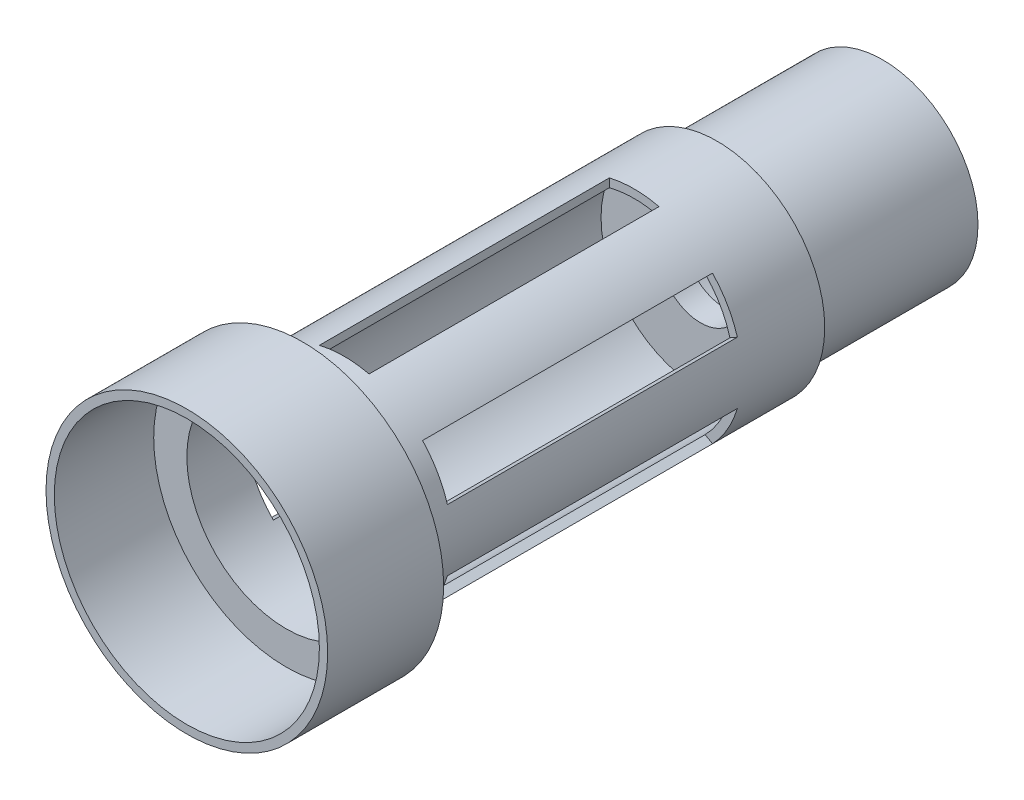
ISO-10303-21;
HEADER;
FILE_DESCRIPTION(('STEP AP214'),'2;1');
FILE_NAME('part.step','',(''),(''),'','','');
FILE_SCHEMA(('AUTOMOTIVE_DESIGN { 1 0 10303 214 1 1 1 1 }'));
ENDSEC;
DATA;
#1=APPLICATION_CONTEXT('core data for automotive mechanical design processes');
#2=APPLICATION_PROTOCOL_DEFINITION('international standard','automotive_design',2000,#1);
#3=PRODUCT_CONTEXT('',#1,'mechanical');
#4=PRODUCT('Part','Part','',(#3));
#5=PRODUCT_RELATED_PRODUCT_CATEGORY('part','',(#4));
#6=PRODUCT_DEFINITION_FORMATION('','',#4);
#7=PRODUCT_DEFINITION_CONTEXT('part definition',#1,'design');
#8=PRODUCT_DEFINITION('design','',#6,#7);
#9=PRODUCT_DEFINITION_SHAPE('','',#8);
#10=(LENGTH_UNIT() NAMED_UNIT(*) SI_UNIT(.MILLI.,.METRE.));
#11=(NAMED_UNIT(*) PLANE_ANGLE_UNIT() SI_UNIT($,.RADIAN.));
#12=(NAMED_UNIT(*) SI_UNIT($,.STERADIAN.) SOLID_ANGLE_UNIT());
#13=UNCERTAINTY_MEASURE_WITH_UNIT(LENGTH_MEASURE(1.E-05),#10,'distance_accuracy_value','');
#14=(GEOMETRIC_REPRESENTATION_CONTEXT(3) GLOBAL_UNCERTAINTY_ASSIGNED_CONTEXT((#13)) GLOBAL_UNIT_ASSIGNED_CONTEXT((#10,
#11,#12)) REPRESENTATION_CONTEXT('',''));
#15=CARTESIAN_POINT('',(0.,0.,0.));
#16=DIRECTION('',(0.,0.,1.));
#17=DIRECTION('',(1.,0.,0.));
#18=AXIS2_PLACEMENT_3D('',#15,#16,#17);
#19=CARTESIAN_POINT('',(0.,0.,91.44));
#20=DIRECTION('',(0.,0.,1.));
#21=DIRECTION('',(1.,0.,0.));
#22=AXIS2_PLACEMENT_3D('',#19,#20,#21);
#23=PLANE('',#22);
#24=CARTESIAN_POINT('',(0.,0.,91.44));
#25=DIRECTION('',(0.,0.,1.));
#26=DIRECTION('',(1.,0.,0.));
#27=AXIS2_PLACEMENT_3D('',#24,#25,#26);
#28=CIRCLE('',#27,15.24);
#29=CARTESIAN_POINT('',(15.24,0.,91.44));
#30=VERTEX_POINT('',#29);
#31=EDGE_CURVE('E521',#30,#30,#28,.T.);
#32=ORIENTED_EDGE('',*,*,#31,.F.);
#33=EDGE_LOOP('',(#32));
#34=FACE_BOUND('',#33,.T.);
#35=CARTESIAN_POINT('',(0.,0.,91.44));
#36=DIRECTION('',(0.,0.,1.));
#37=DIRECTION('',(1.,0.,0.));
#38=AXIS2_PLACEMENT_3D('',#35,#36,#37);
#39=CIRCLE('',#38,20.32);
#40=CARTESIAN_POINT('',(-20.32,0.,91.44));
#41=VERTEX_POINT('',#40);
#42=EDGE_CURVE('E11',#41,#41,#39,.F.);
#43=ORIENTED_EDGE('',*,*,#42,.F.);
#44=EDGE_LOOP('',(#43));
#45=FACE_BOUND('',#44,.T.);
#46=ADVANCED_FACE('F39',(#34,#45),#23,.T.);
#47=CARTESIAN_POINT('',(0.,0.,25.4));
#48=DIRECTION('',(0.,0.,-1.));
#49=DIRECTION('',(-1.,0.,0.));
#50=AXIS2_PLACEMENT_3D('',#47,#48,#49);
#51=CYLINDRICAL_SURFACE('',#50,14.605);
#52=CARTESIAN_POINT('',(0.,0.,25.4));
#53=DIRECTION('',(0.,0.,1.));
#54=DIRECTION('',(1.,0.,0.));
#55=AXIS2_PLACEMENT_3D('',#52,#53,#54);
#56=CIRCLE('',#55,14.605);
#57=CARTESIAN_POINT('',(14.605,0.,25.4));
#58=VERTEX_POINT('',#57);
#59=EDGE_CURVE('E423',#58,#58,#56,.T.);
#60=ORIENTED_EDGE('',*,*,#59,.F.);
#61=EDGE_LOOP('',(#60));
#62=FACE_BOUND('',#61,.T.);
#63=CARTESIAN_POINT('',(0.,0.,0.));
#64=DIRECTION('',(0.,0.,1.));
#65=DIRECTION('',(1.,0.,0.));
#66=AXIS2_PLACEMENT_3D('',#63,#64,#65);
#67=CIRCLE('',#66,14.605);
#68=CARTESIAN_POINT('',(14.605,0.,0.));
#69=VERTEX_POINT('',#68);
#70=EDGE_CURVE('E419',#69,#69,#67,.T.);
#71=ORIENTED_EDGE('',*,*,#70,.T.);
#72=EDGE_LOOP('',(#71));
#73=FACE_BOUND('',#72,.T.);
#74=ADVANCED_FACE('F41',(#62,#73),#51,.T.);
#75=CARTESIAN_POINT('',(0.,0.,0.));
#76=DIRECTION('',(0.,0.,1.));
#77=DIRECTION('',(1.,0.,0.));
#78=AXIS2_PLACEMENT_3D('',#75,#76,#77);
#79=PLANE('',#78);
#80=CARTESIAN_POINT('',(0.,0.,0.));
#81=DIRECTION('',(0.,0.,-1.));
#82=DIRECTION('',(-1.,0.,0.));
#83=AXIS2_PLACEMENT_3D('',#80,#81,#82);
#84=CIRCLE('',#83,13.462);
#85=CARTESIAN_POINT('',(-13.462,0.,0.));
#86=VERTEX_POINT('',#85);
#87=EDGE_CURVE('E406',#86,#86,#84,.T.);
#88=ORIENTED_EDGE('',*,*,#87,.F.);
#89=EDGE_LOOP('',(#88));
#90=FACE_BOUND('',#89,.T.);
#91=ORIENTED_EDGE('',*,*,#70,.F.);
#92=EDGE_LOOP('',(#91));
#93=FACE_BOUND('',#92,.T.);
#94=ADVANCED_FACE('F581',(#90,#93),#79,.F.);
#95=CARTESIAN_POINT('',(0.,0.,88.9));
#96=DIRECTION('',(0.,0.,-1.));
#97=DIRECTION('',(-1.,0.,0.));
#98=AXIS2_PLACEMENT_3D('',#95,#96,#97);
#99=CYLINDRICAL_SURFACE('',#98,16.51);
#100=DIRECTION('',(0.,0.,-1.));
#101=VECTOR('',#100,1.);
#102=CARTESIAN_POINT('',(12.0071529606312,11.3317420452465,88.9));
#103=LINE('',#102,#101);
#104=CARTESIAN_POINT('',(12.0071529606312,11.3317420452465,82.55));
#105=VERTEX_POINT('',#104);
#106=CARTESIAN_POINT('',(12.0071529606312,11.3317420452464,38.1));
#107=VERTEX_POINT('',#106);
#108=EDGE_CURVE('E344',#105,#107,#103,.T.);
#109=ORIENTED_EDGE('',*,*,#108,.T.);
#110=CARTESIAN_POINT('',(0.,0.,38.1));
#111=DIRECTION('',(0.,0.,-1.));
#112=DIRECTION('',(-1.,0.,0.));
#113=AXIS2_PLACEMENT_3D('',#110,#111,#112);
#114=CIRCLE('',#113,16.51);
#115=CARTESIAN_POINT('',(15.8171529606312,4.73262846840906,38.1));
#116=VERTEX_POINT('',#115);
#117=EDGE_CURVE('E487',#107,#116,#114,.T.);
#118=ORIENTED_EDGE('',*,*,#117,.T.);
#119=DIRECTION('',(0.,0.,-1.));
#120=VECTOR('',#119,1.);
#121=CARTESIAN_POINT('',(15.8171529606312,4.73262846840906,88.9));
#122=LINE('',#121,#120);
#123=CARTESIAN_POINT('',(15.8171529606312,4.73262846840906,82.55));
#124=VERTEX_POINT('',#123);
#125=EDGE_CURVE('E293',#116,#124,#122,.F.);
#126=ORIENTED_EDGE('',*,*,#125,.T.);
#127=CARTESIAN_POINT('',(0.,0.,82.55));
#128=DIRECTION('',(0.,0.,1.));
#129=DIRECTION('',(1.,0.,0.));
#130=AXIS2_PLACEMENT_3D('',#127,#128,#129);
#131=CIRCLE('',#130,16.51);
#132=EDGE_CURVE('E329',#124,#105,#131,.T.);
#133=ORIENTED_EDGE('',*,*,#132,.T.);
#134=EDGE_LOOP('',(#109,#118,#126,#133));
#135=FACE_BOUND('',#134,.T.);
#136=CARTESIAN_POINT('',(-15.8171529606312,-4.73262846840903,82.55));
#137=VERTEX_POINT('',#136);
#138=CARTESIAN_POINT('',(-12.0071529606312,-11.3317420452464,82.55));
#139=VERTEX_POINT('',#138);
#140=EDGE_CURVE('E328',#137,#139,#131,.T.);
#141=ORIENTED_EDGE('',*,*,#140,.T.);
#142=DIRECTION('',(0.,0.,-1.));
#143=VECTOR('',#142,1.);
#144=CARTESIAN_POINT('',(-12.0071529606312,-11.3317420452464,88.9));
#145=LINE('',#144,#143);
#146=CARTESIAN_POINT('',(-12.0071529606312,-11.3317420452464,38.1));
#147=VERTEX_POINT('',#146);
#148=EDGE_CURVE('E340',#139,#147,#145,.T.);
#149=ORIENTED_EDGE('',*,*,#148,.T.);
#150=CARTESIAN_POINT('',(-15.8171529606312,-4.73262846840906,38.1));
#151=VERTEX_POINT('',#150);
#152=EDGE_CURVE('E334',#147,#151,#114,.T.);
#153=ORIENTED_EDGE('',*,*,#152,.T.);
#154=DIRECTION('',(0.,0.,-1.));
#155=VECTOR('',#154,1.);
#156=CARTESIAN_POINT('',(-15.8171529606312,-4.73262846840903,88.9));
#157=LINE('',#156,#155);
#158=EDGE_CURVE('E330',#151,#137,#157,.F.);
#159=ORIENTED_EDGE('',*,*,#158,.T.);
#160=EDGE_LOOP('',(#141,#149,#153,#159));
#161=FACE_BOUND('',#160,.T.);
#162=CARTESIAN_POINT('',(-12.0071529606313,11.3317420452463,82.55));
#163=VERTEX_POINT('',#162);
#164=CARTESIAN_POINT('',(-15.8171529606313,4.73262846840881,82.55));
#165=VERTEX_POINT('',#164);
#166=EDGE_CURVE('E493',#163,#165,#131,.T.);
#167=ORIENTED_EDGE('',*,*,#166,.T.);
#168=DIRECTION('',(0.,0.,-1.));
#169=VECTOR('',#168,1.);
#170=CARTESIAN_POINT('',(-15.8171529606313,4.73262846840881,88.9));
#171=LINE('',#170,#169);
#172=CARTESIAN_POINT('',(-15.8171529606313,4.73262846840883,38.1));
#173=VERTEX_POINT('',#172);
#174=EDGE_CURVE('E322',#165,#173,#171,.T.);
#175=ORIENTED_EDGE('',*,*,#174,.T.);
#176=CARTESIAN_POINT('',(-12.0071529606313,11.3317420452463,38.1));
#177=VERTEX_POINT('',#176);
#178=EDGE_CURVE('E339',#173,#177,#114,.T.);
#179=ORIENTED_EDGE('',*,*,#178,.T.);
#180=DIRECTION('',(0.,0.,-1.));
#181=VECTOR('',#180,1.);
#182=CARTESIAN_POINT('',(-12.0071529606313,11.3317420452463,88.9));
#183=LINE('',#182,#181);
#184=EDGE_CURVE('E318',#177,#163,#183,.F.);
#185=ORIENTED_EDGE('',*,*,#184,.T.);
#186=EDGE_LOOP('',(#167,#175,#179,#185));
#187=FACE_BOUND('',#186,.T.);
#188=CARTESIAN_POINT('',(12.0071529606313,-11.3317420452463,82.55));
#189=VERTEX_POINT('',#188);
#190=CARTESIAN_POINT('',(15.8171529606313,-4.73262846840884,82.55));
#191=VERTEX_POINT('',#190);
#192=EDGE_CURVE('E220',#189,#191,#131,.T.);
#193=ORIENTED_EDGE('',*,*,#192,.T.);
#194=DIRECTION('',(0.,0.,-1.));
#195=VECTOR('',#194,1.);
#196=CARTESIAN_POINT('',(15.8171529606313,-4.73262846840884,88.9));
#197=LINE('',#196,#195);
#198=CARTESIAN_POINT('',(15.8171529606313,-4.73262846840883,38.1));
#199=VERTEX_POINT('',#198);
#200=EDGE_CURVE('E300',#191,#199,#197,.T.);
#201=ORIENTED_EDGE('',*,*,#200,.T.);
#202=CARTESIAN_POINT('',(12.0071529606313,-11.3317420452463,38.1));
#203=VERTEX_POINT('',#202);
#204=EDGE_CURVE('E338',#199,#203,#114,.T.);
#205=ORIENTED_EDGE('',*,*,#204,.T.);
#206=DIRECTION('',(0.,0.,-1.));
#207=VECTOR('',#206,1.);
#208=CARTESIAN_POINT('',(12.0071529606313,-11.3317420452463,88.9));
#209=LINE('',#208,#207);
#210=EDGE_CURVE('E295',#203,#189,#209,.F.);
#211=ORIENTED_EDGE('',*,*,#210,.T.);
#212=EDGE_LOOP('',(#193,#201,#205,#211));
#213=FACE_BOUND('',#212,.T.);
#214=DIRECTION('',(0.,0.,-1.));
#215=VECTOR('',#214,1.);
#216=CARTESIAN_POINT('',(-3.80999999999999,-16.0643705136554,88.9));
#217=LINE('',#216,#215);
#218=CARTESIAN_POINT('',(-3.80999999999999,-16.0643705136554,38.1));
#219=VERTEX_POINT('',#218);
#220=CARTESIAN_POINT('',(-3.80999999999999,-16.0643705136554,82.55));
#221=VERTEX_POINT('',#220);
#222=EDGE_CURVE('E386',#219,#221,#217,.F.);
#223=ORIENTED_EDGE('',*,*,#222,.T.);
#224=CARTESIAN_POINT('',(0.,0.,82.55));
#225=DIRECTION('',(0.,0.,1.));
#226=DIRECTION('',(1.,0.,0.));
#227=AXIS2_PLACEMENT_3D('',#224,#225,#226);
#228=CIRCLE('',#227,16.51);
#229=CARTESIAN_POINT('',(3.81000000000001,-16.0643705136554,82.55));
#230=VERTEX_POINT('',#229);
#231=EDGE_CURVE('E374',#221,#230,#228,.T.);
#232=ORIENTED_EDGE('',*,*,#231,.T.);
#233=DIRECTION('',(0.,0.,-1.));
#234=VECTOR('',#233,1.);
#235=CARTESIAN_POINT('',(3.81000000000001,-16.0643705136554,88.9));
#236=LINE('',#235,#234);
#237=CARTESIAN_POINT('',(3.80999999999999,-16.0643705136554,38.1));
#238=VERTEX_POINT('',#237);
#239=EDGE_CURVE('E378',#230,#238,#236,.T.);
#240=ORIENTED_EDGE('',*,*,#239,.T.);
#241=CARTESIAN_POINT('',(0.,0.,38.1));
#242=DIRECTION('',(0.,0.,-1.));
#243=DIRECTION('',(-1.,0.,0.));
#244=AXIS2_PLACEMENT_3D('',#241,#242,#243);
#245=CIRCLE('',#244,16.51);
#246=EDGE_CURVE('E382',#238,#219,#245,.T.);
#247=ORIENTED_EDGE('',*,*,#246,.T.);
#248=EDGE_LOOP('',(#223,#232,#240,#247));
#249=FACE_BOUND('',#248,.T.);
#250=DIRECTION('',(0.,0.,-1.));
#251=VECTOR('',#250,1.);
#252=CARTESIAN_POINT('',(3.81000000000001,16.0643705136554,88.9));
#253=LINE('',#252,#251);
#254=CARTESIAN_POINT('',(3.80999999999999,16.0643705136554,38.1));
#255=VERTEX_POINT('',#254);
#256=CARTESIAN_POINT('',(3.81000000000001,16.0643705136554,82.55));
#257=VERTEX_POINT('',#256);
#258=EDGE_CURVE('E373',#255,#257,#253,.F.);
#259=ORIENTED_EDGE('',*,*,#258,.T.);
#260=CARTESIAN_POINT('',(-3.80999999999999,16.0643705136554,82.55));
#261=VERTEX_POINT('',#260);
#262=EDGE_CURVE('E370',#257,#261,#228,.T.);
#263=ORIENTED_EDGE('',*,*,#262,.T.);
#264=DIRECTION('',(0.,0.,-1.));
#265=VECTOR('',#264,1.);
#266=CARTESIAN_POINT('',(-3.80999999999999,16.0643705136554,88.9));
#267=LINE('',#266,#265);
#268=CARTESIAN_POINT('',(-3.80999999999999,16.0643705136554,38.1));
#269=VERTEX_POINT('',#268);
#270=EDGE_CURVE('E390',#261,#269,#267,.T.);
#271=ORIENTED_EDGE('',*,*,#270,.T.);
#272=EDGE_CURVE('E383',#269,#255,#245,.T.);
#273=ORIENTED_EDGE('',*,*,#272,.T.);
#274=EDGE_LOOP('',(#259,#263,#271,#273));
#275=FACE_BOUND('',#274,.T.);
#276=CARTESIAN_POINT('',(0.,0.,88.9));
#277=DIRECTION('',(0.,0.,1.));
#278=DIRECTION('',(1.,0.,0.));
#279=AXIS2_PLACEMENT_3D('',#276,#277,#278);
#280=CIRCLE('',#279,16.51);
#281=CARTESIAN_POINT('',(16.51,0.,88.9));
#282=VERTEX_POINT('',#281);
#283=EDGE_CURVE('E415',#282,#282,#280,.T.);
#284=ORIENTED_EDGE('',*,*,#283,.F.);
#285=EDGE_LOOP('',(#284));
#286=FACE_BOUND('',#285,.T.);
#287=CARTESIAN_POINT('',(0.,0.,25.4));
#288=DIRECTION('',(0.,0.,1.));
#289=DIRECTION('',(1.,0.,0.));
#290=AXIS2_PLACEMENT_3D('',#287,#288,#289);
#291=CIRCLE('',#290,16.51);
#292=CARTESIAN_POINT('',(16.51,0.,25.4));
#293=VERTEX_POINT('',#292);
#294=EDGE_CURVE('E411',#293,#293,#291,.T.);
#295=ORIENTED_EDGE('',*,*,#294,.T.);
#296=EDGE_LOOP('',(#295));
#297=FACE_BOUND('',#296,.T.);
#298=ADVANCED_FACE('F473',(#135,#161,#187,#213,#249,#275,#286,#297),#99,.T.);
#299=CARTESIAN_POINT('',(0.,0.,25.4));
#300=DIRECTION('',(0.,0.,1.));
#301=DIRECTION('',(1.,0.,0.));
#302=AXIS2_PLACEMENT_3D('',#299,#300,#301);
#303=PLANE('',#302);
#304=ORIENTED_EDGE('',*,*,#59,.T.);
#305=EDGE_LOOP('',(#304));
#306=FACE_BOUND('',#305,.T.);
#307=ORIENTED_EDGE('',*,*,#294,.F.);
#308=EDGE_LOOP('',(#307));
#309=FACE_BOUND('',#308,.T.);
#310=ADVANCED_FACE('F641',(#306,#309),#303,.F.);
#311=CARTESIAN_POINT('',(0.,0.,24.13));
#312=DIRECTION('',(0.,0.,-1.));
#313=DIRECTION('',(-1.,0.,0.));
#314=AXIS2_PLACEMENT_3D('',#311,#312,#313);
#315=CYLINDRICAL_SURFACE('',#314,13.462);
#316=CARTESIAN_POINT('',(0.,0.,24.13));
#317=DIRECTION('',(0.,0.,-1.));
#318=DIRECTION('',(-1.,0.,0.));
#319=AXIS2_PLACEMENT_3D('',#316,#317,#318);
#320=CIRCLE('',#319,13.462);
#321=CARTESIAN_POINT('',(-13.462,0.,24.13));
#322=VERTEX_POINT('',#321);
#323=EDGE_CURVE('E407',#322,#322,#320,.T.);
#324=CARTESIAN_POINT('',(-13.462,0.,24.13));
#325=CARTESIAN_POINT('',(-13.462,0.,23.8786458333333));
#326=CARTESIAN_POINT('',(-13.462,0.,23.6272916666667));
#327=CARTESIAN_POINT('',(-13.462,0.,23.1245833333333));
#328=CARTESIAN_POINT('',(-13.462,0.,22.8732291666667));
#329=CARTESIAN_POINT('',(-13.462,0.,22.3705208333333));
#330=CARTESIAN_POINT('',(-13.462,0.,22.1191666666667));
#331=CARTESIAN_POINT('',(-13.462,0.,21.6164583333333));
#332=CARTESIAN_POINT('',(-13.462,0.,21.3651041666667));
#333=CARTESIAN_POINT('',(-13.462,0.,20.8623958333333));
#334=CARTESIAN_POINT('',(-13.462,0.,20.6110416666667));
#335=CARTESIAN_POINT('',(-13.462,0.,20.1083333333333));
#336=CARTESIAN_POINT('',(-13.462,0.,19.8569791666667));
#337=CARTESIAN_POINT('',(-13.462,0.,19.3542708333333));
#338=CARTESIAN_POINT('',(-13.462,0.,19.1029166666667));
#339=CARTESIAN_POINT('',(-13.462,0.,18.6002083333333));
#340=CARTESIAN_POINT('',(-13.462,0.,18.3488541666667));
#341=CARTESIAN_POINT('',(-13.462,0.,17.8461458333333));
#342=CARTESIAN_POINT('',(-13.462,0.,17.5947916666667));
#343=CARTESIAN_POINT('',(-13.462,0.,17.0920833333333));
#344=CARTESIAN_POINT('',(-13.462,0.,16.8407291666667));
#345=CARTESIAN_POINT('',(-13.462,0.,16.3380208333333));
#346=CARTESIAN_POINT('',(-13.462,0.,16.0866666666667));
#347=CARTESIAN_POINT('',(-13.462,0.,15.5839583333333));
#348=CARTESIAN_POINT('',(-13.462,0.,15.3326041666667));
#349=CARTESIAN_POINT('',(-13.462,0.,14.8298958333333));
#350=CARTESIAN_POINT('',(-13.462,0.,14.5785416666667));
#351=CARTESIAN_POINT('',(-13.462,0.,14.0758333333333));
#352=CARTESIAN_POINT('',(-13.462,0.,13.8244791666667));
#353=CARTESIAN_POINT('',(-13.462,0.,13.3217708333333));
#354=CARTESIAN_POINT('',(-13.462,0.,13.0704166666667));
#355=CARTESIAN_POINT('',(-13.462,0.,12.5677083333333));
#356=CARTESIAN_POINT('',(-13.462,0.,12.3163541666667));
#357=CARTESIAN_POINT('',(-13.462,0.,11.8136458333333));
#358=CARTESIAN_POINT('',(-13.462,0.,11.5622916666667));
#359=CARTESIAN_POINT('',(-13.462,0.,11.0595833333333));
#360=CARTESIAN_POINT('',(-13.462,0.,10.8082291666667));
#361=CARTESIAN_POINT('',(-13.462,0.,10.3055208333333));
#362=CARTESIAN_POINT('',(-13.462,0.,10.0541666666667));
#363=CARTESIAN_POINT('',(-13.462,0.,9.55145833333334));
#364=CARTESIAN_POINT('',(-13.462,0.,9.30010416666667));
#365=CARTESIAN_POINT('',(-13.462,0.,8.79739583333334));
#366=CARTESIAN_POINT('',(-13.462,0.,8.54604166666667));
#367=CARTESIAN_POINT('',(-13.462,0.,8.04333333333333));
#368=CARTESIAN_POINT('',(-13.462,0.,7.79197916666667));
#369=CARTESIAN_POINT('',(-13.462,0.,7.28927083333334));
#370=CARTESIAN_POINT('',(-13.462,0.,7.03791666666667));
#371=CARTESIAN_POINT('',(-13.462,0.,6.53520833333334));
#372=CARTESIAN_POINT('',(-13.462,0.,6.28385416666667));
#373=CARTESIAN_POINT('',(-13.462,0.,5.78114583333334));
#374=CARTESIAN_POINT('',(-13.462,0.,5.52979166666667));
#375=CARTESIAN_POINT('',(-13.462,0.,5.02708333333334));
#376=CARTESIAN_POINT('',(-13.462,0.,4.77572916666667));
#377=CARTESIAN_POINT('',(-13.462,0.,4.27302083333334));
#378=CARTESIAN_POINT('',(-13.462,0.,4.02166666666667));
#379=CARTESIAN_POINT('',(-13.462,0.,3.51895833333334));
#380=CARTESIAN_POINT('',(-13.462,0.,3.26760416666667));
#381=CARTESIAN_POINT('',(-13.462,0.,2.76489583333333));
#382=CARTESIAN_POINT('',(-13.462,0.,2.51354166666667));
#383=CARTESIAN_POINT('',(-13.462,0.,2.01083333333334));
#384=CARTESIAN_POINT('',(-13.462,0.,1.75947916666667));
#385=CARTESIAN_POINT('',(-13.462,0.,1.25677083333334));
#386=CARTESIAN_POINT('',(-13.462,0.,1.00541666666667));
#387=CARTESIAN_POINT('',(-13.462,0.,0.502708333333336));
#388=CARTESIAN_POINT('',(-13.462,0.,0.25135416666667));
#389=CARTESIAN_POINT('',(-13.462,0.,0.));
#390=B_SPLINE_CURVE_WITH_KNOTS('',3,(#324,#325,#326,#327,#328,#329,#330,#331,#332,#333,#334,
#335,#336,#337,#338,#339,#340,#341,#342,#343,#344,#345,#346,#347,#348,#349,#350,#351,#352,#353,
#354,#355,#356,#357,#358,#359,#360,#361,#362,#363,#364,#365,#366,#367,#368,#369,#370,#371,#372,
#373,#374,#375,#376,#377,#378,#379,#380,#381,#382,#383,#384,#385,#386,#387,#388,#389),
.UNSPECIFIED.,.F.,.F.,(4,2,2,2,2,2,2,2,2,2,2,2,2,2,2,2,2,2,2,2,2,2,2,2,2,2,2,2,2,2,2,2,4),(0.,
0.7540625,1.508125,2.2621875,3.01625,3.7703125,4.524375,5.2784375,6.0325,6.7865625,7.540625,
8.29468749999999,9.04875,9.8028125,10.556875,11.3109375,12.065,12.8190625,13.573125,14.3271875,
15.08125,15.8353125,16.589375,17.3434375,18.0975,18.8515625,19.605625,20.3596875,21.11375,
21.8678125,22.621875,23.3759375,24.13),.UNSPECIFIED.);
#391=EDGE_CURVE('BSEAM637',#322,#86,#390,.T.);
#392=ORIENTED_EDGE('',*,*,#323,.F.);
#393=ORIENTED_EDGE('',*,*,#87,.T.);
#394=ORIENTED_EDGE('',*,*,#391,.T.);
#395=ORIENTED_EDGE('',*,*,#391,.F.);
#396=EDGE_LOOP('',(#392,#394,#393,#395));
#397=FACE_BOUND('',#396,.T.);
#398=ADVANCED_FACE('F637',(#397),#315,.F.);
#399=CARTESIAN_POINT('',(0.,0.,24.13));
#400=DIRECTION('',(0.,0.,-1.));
#401=DIRECTION('',(-1.,0.,0.));
#402=AXIS2_PLACEMENT_3D('',#399,#400,#401);
#403=PLANE('',#402);
#404=CARTESIAN_POINT('',(0.,0.,24.13));
#405=DIRECTION('',(0.,0.,-1.));
#406=DIRECTION('',(-1.,0.,0.));
#407=AXIS2_PLACEMENT_3D('',#404,#405,#406);
#408=CIRCLE('',#407,6.35);
#409=CARTESIAN_POINT('',(-6.35,0.,24.13));
#410=VERTEX_POINT('',#409);
#411=EDGE_CURVE('E394',#410,#410,#408,.F.);
#412=ORIENTED_EDGE('',*,*,#411,.T.);
#413=EDGE_LOOP('',(#412));
#414=FACE_BOUND('',#413,.T.);
#415=ORIENTED_EDGE('',*,*,#323,.T.);
#416=EDGE_LOOP('',(#415));
#417=FACE_BOUND('',#416,.T.);
#418=ADVANCED_FACE('F634',(#414,#417),#403,.T.);
#419=CARTESIAN_POINT('',(0.,0.,27.94));
#420=DIRECTION('',(0.,0.,1.));
#421=DIRECTION('',(1.,0.,0.));
#422=AXIS2_PLACEMENT_3D('',#419,#420,#421);
#423=CYLINDRICAL_SURFACE('',#422,15.24);
#424=CARTESIAN_POINT('',(0.,0.,38.1));
#425=DIRECTION('',(0.,0.,-1.));
#426=DIRECTION('',(-1.,0.,0.));
#427=AXIS2_PLACEMENT_3D('',#424,#425,#426);
#428=CIRCLE('',#427,15.24);
#429=CARTESIAN_POINT('',(-14.6841284914113,-4.0784764861065,38.1));
#430=VERTEX_POINT('',#429);
#431=CARTESIAN_POINT('',(-10.8741284914113,-10.6775900629439,38.1));
#432=VERTEX_POINT('',#431);
#433=EDGE_CURVE('E237',#430,#432,#428,.F.);
#434=ORIENTED_EDGE('',*,*,#433,.T.);
#435=DIRECTION('',(0.,0.,1.));
#436=VECTOR('',#435,1.);
#437=CARTESIAN_POINT('',(-10.8741284914113,-10.6775900629439,27.94));
#438=LINE('',#437,#436);
#439=CARTESIAN_POINT('',(-10.8741284914113,-10.6775900629439,82.55));
#440=VERTEX_POINT('',#439);
#441=EDGE_CURVE('E48',#432,#440,#438,.T.);
#442=ORIENTED_EDGE('',*,*,#441,.T.);
#443=CARTESIAN_POINT('',(0.,0.,82.55));
#444=DIRECTION('',(0.,0.,1.));
#445=DIRECTION('',(1.,0.,0.));
#446=AXIS2_PLACEMENT_3D('',#443,#444,#445);
#447=CIRCLE('',#446,15.24);
#448=CARTESIAN_POINT('',(-14.6841284914113,-4.07847648610648,82.55));
#449=VERTEX_POINT('',#448);
#450=EDGE_CURVE('E233',#440,#449,#447,.F.);
#451=ORIENTED_EDGE('',*,*,#450,.T.);
#452=DIRECTION('',(0.,0.,1.));
#453=VECTOR('',#452,1.);
#454=CARTESIAN_POINT('',(-14.6841284914113,-4.0784764861065,27.94));
#455=LINE('',#454,#453);
#456=EDGE_CURVE('E241',#449,#430,#455,.F.);
#457=ORIENTED_EDGE('',*,*,#456,.T.);
#458=EDGE_LOOP('',(#434,#442,#451,#457));
#459=FACE_BOUND('',#458,.T.);
#460=DIRECTION('',(0.,0.,1.));
#461=VECTOR('',#460,1.);
#462=CARTESIAN_POINT('',(14.6841284914113,4.07847648610649,27.94));
#463=LINE('',#462,#461);
#464=CARTESIAN_POINT('',(14.6841284914113,4.07847648610649,82.55));
#465=VERTEX_POINT('',#464);
#466=CARTESIAN_POINT('',(14.6841284914113,4.0784764861065,38.1));
#467=VERTEX_POINT('',#466);
#468=EDGE_CURVE('E263',#465,#467,#463,.F.);
#469=ORIENTED_EDGE('',*,*,#468,.T.);
#470=CARTESIAN_POINT('',(10.8741284914113,10.6775900629439,38.1));
#471=VERTEX_POINT('',#470);
#472=EDGE_CURVE('E242',#467,#471,#428,.F.);
#473=ORIENTED_EDGE('',*,*,#472,.T.);
#474=DIRECTION('',(0.,0.,1.));
#475=VECTOR('',#474,1.);
#476=CARTESIAN_POINT('',(10.8741284914113,10.6775900629439,27.94));
#477=LINE('',#476,#475);
#478=CARTESIAN_POINT('',(10.8741284914112,10.6775900629439,82.55));
#479=VERTEX_POINT('',#478);
#480=EDGE_CURVE('E257',#471,#479,#477,.T.);
#481=ORIENTED_EDGE('',*,*,#480,.T.);
#482=EDGE_CURVE('E243',#479,#465,#447,.F.);
#483=ORIENTED_EDGE('',*,*,#482,.T.);
#484=EDGE_LOOP('',(#469,#473,#481,#483));
#485=FACE_BOUND('',#484,.T.);
#486=CARTESIAN_POINT('',(-10.8741284914114,10.6775900629437,38.1));
#487=VERTEX_POINT('',#486);
#488=CARTESIAN_POINT('',(-14.6841284914113,4.07847648610629,38.1));
#489=VERTEX_POINT('',#488);
#490=EDGE_CURVE('E238',#487,#489,#428,.F.);
#491=ORIENTED_EDGE('',*,*,#490,.T.);
#492=DIRECTION('',(0.,0.,1.));
#493=VECTOR('',#492,1.);
#494=CARTESIAN_POINT('',(-14.6841284914113,4.07847648610629,27.94));
#495=LINE('',#494,#493);
#496=CARTESIAN_POINT('',(-14.6841284914113,4.07847648610627,82.55));
#497=VERTEX_POINT('',#496);
#498=EDGE_CURVE('E253',#489,#497,#495,.T.);
#499=ORIENTED_EDGE('',*,*,#498,.T.);
#500=CARTESIAN_POINT('',(-10.8741284914114,10.6775900629437,82.55));
#501=VERTEX_POINT('',#500);
#502=EDGE_CURVE('E234',#497,#501,#447,.F.);
#503=ORIENTED_EDGE('',*,*,#502,.T.);
#504=DIRECTION('',(0.,0.,1.));
#505=VECTOR('',#504,1.);
#506=CARTESIAN_POINT('',(-10.8741284914114,10.6775900629437,27.94));
#507=LINE('',#506,#505);
#508=EDGE_CURVE('E246',#501,#487,#507,.F.);
#509=ORIENTED_EDGE('',*,*,#508,.T.);
#510=EDGE_LOOP('',(#491,#499,#503,#509));
#511=FACE_BOUND('',#510,.T.);
#512=CARTESIAN_POINT('',(10.8741284914114,-10.6775900629437,38.1));
#513=VERTEX_POINT('',#512);
#514=CARTESIAN_POINT('',(14.6841284914113,-4.07847648610629,38.1));
#515=VERTEX_POINT('',#514);
#516=EDGE_CURVE('E231',#513,#515,#428,.F.);
#517=ORIENTED_EDGE('',*,*,#516,.T.);
#518=DIRECTION('',(0.,0.,1.));
#519=VECTOR('',#518,1.);
#520=CARTESIAN_POINT('',(14.6841284914113,-4.07847648610629,27.94));
#521=LINE('',#520,#519);
#522=CARTESIAN_POINT('',(14.6841284914113,-4.07847648610629,82.55));
#523=VERTEX_POINT('',#522);
#524=EDGE_CURVE('E229',#515,#523,#521,.T.);
#525=ORIENTED_EDGE('',*,*,#524,.T.);
#526=CARTESIAN_POINT('',(10.8741284914114,-10.6775900629437,82.55));
#527=VERTEX_POINT('',#526);
#528=EDGE_CURVE('E212',#523,#527,#447,.F.);
#529=ORIENTED_EDGE('',*,*,#528,.T.);
#530=DIRECTION('',(0.,0.,1.));
#531=VECTOR('',#530,1.);
#532=CARTESIAN_POINT('',(10.8741284914114,-10.6775900629437,27.94));
#533=LINE('',#532,#531);
#534=EDGE_CURVE('E200',#527,#513,#533,.F.);
#535=ORIENTED_EDGE('',*,*,#534,.T.);
#536=EDGE_LOOP('',(#517,#525,#529,#535));
#537=FACE_BOUND('',#536,.T.);
#538=CARTESIAN_POINT('',(0.,0.,82.55));
#539=DIRECTION('',(0.,0.,1.));
#540=DIRECTION('',(1.,0.,0.));
#541=AXIS2_PLACEMENT_3D('',#538,#539,#540);
#542=CIRCLE('',#541,15.24);
#543=CARTESIAN_POINT('',(3.81000000000001,-14.7560665490503,82.55));
#544=VERTEX_POINT('',#543);
#545=CARTESIAN_POINT('',(-3.80999999999999,-14.7560665490503,82.55));
#546=VERTEX_POINT('',#545);
#547=EDGE_CURVE('E435',#544,#546,#542,.F.);
#548=ORIENTED_EDGE('',*,*,#547,.T.);
#549=DIRECTION('',(0.,0.,1.));
#550=VECTOR('',#549,1.);
#551=CARTESIAN_POINT('',(-3.80999999999999,-14.7560665490503,27.94));
#552=LINE('',#551,#550);
#553=CARTESIAN_POINT('',(-3.80999999999999,-14.7560665490503,38.1));
#554=VERTEX_POINT('',#553);
#555=EDGE_CURVE('E213',#546,#554,#552,.F.);
#556=ORIENTED_EDGE('',*,*,#555,.T.);
#557=CARTESIAN_POINT('',(0.,0.,38.1));
#558=DIRECTION('',(0.,0.,-1.));
#559=DIRECTION('',(-1.,0.,0.));
#560=AXIS2_PLACEMENT_3D('',#557,#558,#559);
#561=CIRCLE('',#560,15.24);
#562=CARTESIAN_POINT('',(3.80999999999999,-14.7560665490503,38.1));
#563=VERTEX_POINT('',#562);
#564=EDGE_CURVE('E444',#554,#563,#561,.F.);
#565=ORIENTED_EDGE('',*,*,#564,.T.);
#566=DIRECTION('',(0.,0.,1.));
#567=VECTOR('',#566,1.);
#568=CARTESIAN_POINT('',(3.80999999999999,-14.7560665490503,27.94));
#569=LINE('',#568,#567);
#570=EDGE_CURVE('E448',#563,#544,#569,.T.);
#571=ORIENTED_EDGE('',*,*,#570,.T.);
#572=EDGE_LOOP('',(#548,#556,#565,#571));
#573=FACE_BOUND('',#572,.T.);
#574=CARTESIAN_POINT('',(3.80999999999999,14.7560665490503,38.1));
#575=VERTEX_POINT('',#574);
#576=CARTESIAN_POINT('',(-3.80999999999999,14.7560665490503,38.1));
#577=VERTEX_POINT('',#576);
#578=EDGE_CURVE('E439',#575,#577,#561,.F.);
#579=ORIENTED_EDGE('',*,*,#578,.T.);
#580=DIRECTION('',(0.,0.,1.));
#581=VECTOR('',#580,1.);
#582=CARTESIAN_POINT('',(-3.80999999999999,14.7560665490503,27.94));
#583=LINE('',#582,#581);
#584=CARTESIAN_POINT('',(-3.80999999999999,14.7560665490503,82.55));
#585=VERTEX_POINT('',#584);
#586=EDGE_CURVE('E443',#577,#585,#583,.T.);
#587=ORIENTED_EDGE('',*,*,#586,.T.);
#588=CARTESIAN_POINT('',(3.81000000000001,14.7560665490503,82.55));
#589=VERTEX_POINT('',#588);
#590=EDGE_CURVE('E427',#585,#589,#542,.F.);
#591=ORIENTED_EDGE('',*,*,#590,.T.);
#592=DIRECTION('',(0.,0.,1.));
#593=VECTOR('',#592,1.);
#594=CARTESIAN_POINT('',(3.80999999999999,14.7560665490503,27.94));
#595=LINE('',#594,#593);
#596=EDGE_CURVE('E434',#589,#575,#595,.F.);
#597=ORIENTED_EDGE('',*,*,#596,.T.);
#598=EDGE_LOOP('',(#579,#587,#591,#597));
#599=FACE_BOUND('',#598,.T.);
#600=CARTESIAN_POINT('',(0.,0.,27.94));
#601=DIRECTION('',(0.,0.,1.));
#602=DIRECTION('',(1.,0.,0.));
#603=AXIS2_PLACEMENT_3D('',#600,#601,#602);
#604=CIRCLE('',#603,15.24);
#605=CARTESIAN_POINT('',(15.24,0.,27.94));
#606=VERTEX_POINT('',#605);
#607=EDGE_CURVE('E399',#606,#606,#604,.T.);
#608=ORIENTED_EDGE('',*,*,#607,.F.);
#609=EDGE_LOOP('',(#608));
#610=FACE_BOUND('',#609,.T.);
#611=ORIENTED_EDGE('',*,*,#31,.T.);
#612=EDGE_LOOP('',(#611));
#613=FACE_BOUND('',#612,.T.);
#614=ADVANCED_FACE('F227',(#459,#485,#511,#537,#573,#599,#610,#613),#423,.F.);
#615=CARTESIAN_POINT('',(0.,0.,27.94));
#616=DIRECTION('',(0.,0.,1.));
#617=DIRECTION('',(1.,0.,0.));
#618=AXIS2_PLACEMENT_3D('',#615,#616,#617);
#619=PLANE('',#618);
#620=CARTESIAN_POINT('',(0.,0.,27.94));
#621=DIRECTION('',(0.,0.,1.));
#622=DIRECTION('',(1.,0.,0.));
#623=AXIS2_PLACEMENT_3D('',#620,#621,#622);
#624=CIRCLE('',#623,6.35);
#625=CARTESIAN_POINT('',(6.35,0.,27.94));
#626=VERTEX_POINT('',#625);
#627=EDGE_CURVE('E395',#626,#626,#624,.T.);
#628=ORIENTED_EDGE('',*,*,#627,.F.);
#629=EDGE_LOOP('',(#628));
#630=FACE_BOUND('',#629,.T.);
#631=ORIENTED_EDGE('',*,*,#607,.T.);
#632=EDGE_LOOP('',(#631));
#633=FACE_BOUND('',#632,.T.);
#634=ADVANCED_FACE('F627',(#630,#633),#619,.T.);
#635=CARTESIAN_POINT('',(0.,0.,-0.001000000000001));
#636=DIRECTION('',(0.,0.,1.));
#637=DIRECTION('',(1.,0.,0.));
#638=AXIS2_PLACEMENT_3D('',#635,#636,#637);
#639=CYLINDRICAL_SURFACE('',#638,6.35);
#640=ORIENTED_EDGE('',*,*,#411,.F.);
#641=EDGE_LOOP('',(#640));
#642=FACE_BOUND('',#641,.T.);
#643=ORIENTED_EDGE('',*,*,#627,.T.);
#644=EDGE_LOOP('',(#643));
#645=FACE_BOUND('',#644,.T.);
#646=ADVANCED_FACE('F620',(#642,#645),#639,.F.);
#647=CARTESIAN_POINT('',(-3.80999999999999,-16.51,82.55));
#648=DIRECTION('',(0.,0.,1.));
#649=DIRECTION('',(1.,0.,0.));
#650=AXIS2_PLACEMENT_3D('',#647,#648,#649);
#651=PLANE('',#650);
#652=DIRECTION('',(0.,1.,0.));
#653=VECTOR('',#652,1.);
#654=CARTESIAN_POINT('',(3.81000000000001,-16.51,82.55));
#655=LINE('',#654,#653);
#656=EDGE_CURVE('E362',#589,#257,#655,.T.);
#657=ORIENTED_EDGE('',*,*,#656,.F.);
#658=ORIENTED_EDGE('',*,*,#590,.F.);
#659=DIRECTION('',(0.,1.,0.));
#660=VECTOR('',#659,1.);
#661=CARTESIAN_POINT('',(-3.80999999999999,-16.51,82.55));
#662=LINE('',#661,#660);
#663=EDGE_CURVE('E350',#585,#261,#662,.T.);
#664=ORIENTED_EDGE('',*,*,#663,.T.);
#665=ORIENTED_EDGE('',*,*,#262,.F.);
#666=EDGE_LOOP('',(#657,#658,#664,#665));
#667=FACE_BOUND('',#666,.T.);
#668=ADVANCED_FACE('F617',(#667),#651,.F.);
#669=CARTESIAN_POINT('',(3.80999999999999,-16.51,38.1));
#670=DIRECTION('',(1.,0.,0.));
#671=DIRECTION('',(0.,0.,-1.));
#672=AXIS2_PLACEMENT_3D('',#669,#670,#671);
#673=PLANE('',#672);
#674=DIRECTION('',(0.,1.,0.));
#675=VECTOR('',#674,1.);
#676=CARTESIAN_POINT('',(3.80999999999999,-16.51,38.1));
#677=LINE('',#676,#675);
#678=EDGE_CURVE('E357',#575,#255,#677,.T.);
#679=ORIENTED_EDGE('',*,*,#678,.F.);
#680=ORIENTED_EDGE('',*,*,#596,.F.);
#681=ORIENTED_EDGE('',*,*,#656,.T.);
#682=ORIENTED_EDGE('',*,*,#258,.F.);
#683=EDGE_LOOP('',(#679,#680,#681,#682));
#684=FACE_BOUND('',#683,.T.);
#685=ADVANCED_FACE('F613',(#684),#673,.F.);
#686=CARTESIAN_POINT('',(-3.80999999999999,-16.51,38.1));
#687=DIRECTION('',(0.,0.,-1.));
#688=DIRECTION('',(-1.,0.,0.));
#689=AXIS2_PLACEMENT_3D('',#686,#687,#688);
#690=PLANE('',#689);
#691=DIRECTION('',(0.,1.,0.));
#692=VECTOR('',#691,1.);
#693=CARTESIAN_POINT('',(-3.80999999999999,-16.51,38.1));
#694=LINE('',#693,#692);
#695=EDGE_CURVE('E351',#577,#269,#694,.T.);
#696=ORIENTED_EDGE('',*,*,#695,.F.);
#697=ORIENTED_EDGE('',*,*,#578,.F.);
#698=ORIENTED_EDGE('',*,*,#678,.T.);
#699=ORIENTED_EDGE('',*,*,#272,.F.);
#700=EDGE_LOOP('',(#696,#697,#698,#699));
#701=FACE_BOUND('',#700,.T.);
#702=ADVANCED_FACE('F609',(#701),#690,.F.);
#703=CARTESIAN_POINT('',(-3.80999999999999,-16.51,38.1));
#704=DIRECTION('',(-1.,0.,0.));
#705=DIRECTION('',(0.,0.,1.));
#706=AXIS2_PLACEMENT_3D('',#703,#704,#705);
#707=PLANE('',#706);
#708=ORIENTED_EDGE('',*,*,#663,.F.);
#709=ORIENTED_EDGE('',*,*,#586,.F.);
#710=ORIENTED_EDGE('',*,*,#695,.T.);
#711=ORIENTED_EDGE('',*,*,#270,.F.);
#712=EDGE_LOOP('',(#708,#709,#710,#711));
#713=FACE_BOUND('',#712,.T.);
#714=ADVANCED_FACE('F612',(#713),#707,.F.);
#715=EDGE_CURVE('E355',#219,#554,#694,.T.);
#716=ORIENTED_EDGE('',*,*,#715,.T.);
#717=ORIENTED_EDGE('',*,*,#555,.F.);
#718=EDGE_CURVE('E366',#221,#546,#662,.T.);
#719=ORIENTED_EDGE('',*,*,#718,.F.);
#720=ORIENTED_EDGE('',*,*,#222,.F.);
#721=EDGE_LOOP('',(#716,#717,#719,#720));
#722=FACE_BOUND('',#721,.T.);
#723=ADVANCED_FACE('F467',(#722),#707,.F.);
#724=EDGE_CURVE('E356',#238,#563,#677,.T.);
#725=ORIENTED_EDGE('',*,*,#724,.T.);
#726=ORIENTED_EDGE('',*,*,#564,.F.);
#727=ORIENTED_EDGE('',*,*,#715,.F.);
#728=ORIENTED_EDGE('',*,*,#246,.F.);
#729=EDGE_LOOP('',(#725,#726,#727,#728));
#730=FACE_BOUND('',#729,.T.);
#731=ADVANCED_FACE('F463',(#730),#690,.F.);
#732=EDGE_CURVE('E361',#230,#544,#655,.T.);
#733=ORIENTED_EDGE('',*,*,#732,.T.);
#734=ORIENTED_EDGE('',*,*,#570,.F.);
#735=ORIENTED_EDGE('',*,*,#724,.F.);
#736=ORIENTED_EDGE('',*,*,#239,.F.);
#737=EDGE_LOOP('',(#733,#734,#735,#736));
#738=FACE_BOUND('',#737,.T.);
#739=ADVANCED_FACE('F481',(#738),#673,.F.);
#740=ORIENTED_EDGE('',*,*,#718,.T.);
#741=ORIENTED_EDGE('',*,*,#547,.F.);
#742=ORIENTED_EDGE('',*,*,#732,.F.);
#743=ORIENTED_EDGE('',*,*,#231,.F.);
#744=EDGE_LOOP('',(#740,#741,#742,#743));
#745=FACE_BOUND('',#744,.T.);
#746=ADVANCED_FACE('F478',(#745),#651,.F.);
#747=CARTESIAN_POINT('',(-17.6265397082406,14.5760964966591,38.1));
#748=DIRECTION('',(0.499999999999992,0.866025403784443,0.));
#749=DIRECTION('',(-0.866025403784443,0.499999999999992,0.));
#750=AXIS2_PLACEMENT_3D('',#747,#748,#749);
#751=PLANE('',#750);
#752=DIRECTION('',(0.866025403784443,-0.499999999999992,0.));
#753=VECTOR('',#752,1.);
#754=CARTESIAN_POINT('',(-17.6265397082406,14.5760964966591,82.55));
#755=LINE('',#754,#753);
#756=EDGE_CURVE('E536',#523,#191,#755,.T.);
#757=ORIENTED_EDGE('',*,*,#756,.F.);
#758=ORIENTED_EDGE('',*,*,#524,.F.);
#759=DIRECTION('',(0.866025403784443,-0.499999999999992,0.));
#760=VECTOR('',#759,1.);
#761=CARTESIAN_POINT('',(-17.6265397082406,14.5760964966591,38.1));
#762=LINE('',#761,#760);
#763=EDGE_CURVE('E511',#515,#199,#762,.T.);
#764=ORIENTED_EDGE('',*,*,#763,.T.);
#765=ORIENTED_EDGE('',*,*,#200,.F.);
#766=EDGE_LOOP('',(#757,#758,#764,#765));
#767=FACE_BOUND('',#766,.T.);
#768=ADVANCED_FACE('F535',(#767),#751,.F.);
#769=CARTESIAN_POINT('',(-21.4365397082406,7.97698291982161,38.1));
#770=DIRECTION('',(-0.499999999999992,-0.866025403784443,0.));
#771=DIRECTION('',(0.866025403784443,-0.499999999999992,0.));
#772=AXIS2_PLACEMENT_3D('',#769,#770,#771);
#773=PLANE('',#772);
#774=DIRECTION('',(0.866025403784443,-0.499999999999992,0.));
#775=VECTOR('',#774,1.);
#776=CARTESIAN_POINT('',(-21.4365397082406,7.97698291982161,38.1));
#777=LINE('',#776,#775);
#778=EDGE_CURVE('E206',#513,#203,#777,.T.);
#779=ORIENTED_EDGE('',*,*,#778,.F.);
#780=ORIENTED_EDGE('',*,*,#534,.F.);
#781=DIRECTION('',(0.866025403784443,-0.499999999999992,0.));
#782=VECTOR('',#781,1.);
#783=CARTESIAN_POINT('',(-21.4365397082406,7.97698291982159,82.55));
#784=LINE('',#783,#782);
#785=EDGE_CURVE('E203',#527,#189,#784,.T.);
#786=ORIENTED_EDGE('',*,*,#785,.T.);
#787=ORIENTED_EDGE('',*,*,#210,.F.);
#788=EDGE_LOOP('',(#779,#780,#786,#787));
#789=FACE_BOUND('',#788,.T.);
#790=ADVANCED_FACE('F202',(#789),#773,.F.);
#791=CARTESIAN_POINT('',(21.4365397082405,7.97698291982195,82.55));
#792=DIRECTION('',(0.,0.,1.));
#793=DIRECTION('',(1.,0.,0.));
#794=AXIS2_PLACEMENT_3D('',#791,#792,#793);
#795=PLANE('',#794);
#796=ORIENTED_EDGE('',*,*,#785,.F.);
#797=ORIENTED_EDGE('',*,*,#528,.F.);
#798=ORIENTED_EDGE('',*,*,#756,.T.);
#799=ORIENTED_EDGE('',*,*,#192,.F.);
#800=EDGE_LOOP('',(#796,#797,#798,#799));
#801=FACE_BOUND('',#800,.T.);
#802=ADVANCED_FACE('F216',(#801),#795,.F.);
#803=CARTESIAN_POINT('',(21.4365397082405,7.97698291982195,38.1));
#804=DIRECTION('',(0.,0.,-1.));
#805=DIRECTION('',(-1.,0.,0.));
#806=AXIS2_PLACEMENT_3D('',#803,#804,#805);
#807=PLANE('',#806);
#808=ORIENTED_EDGE('',*,*,#763,.F.);
#809=ORIENTED_EDGE('',*,*,#516,.F.);
#810=ORIENTED_EDGE('',*,*,#778,.T.);
#811=ORIENTED_EDGE('',*,*,#204,.F.);
#812=EDGE_LOOP('',(#808,#809,#810,#811));
#813=FACE_BOUND('',#812,.T.);
#814=ADVANCED_FACE('F532',(#813),#807,.F.);
#815=EDGE_CURVE('E223',#165,#497,#784,.T.);
#816=ORIENTED_EDGE('',*,*,#815,.T.);
#817=ORIENTED_EDGE('',*,*,#498,.F.);
#818=EDGE_CURVE('E518',#173,#489,#777,.T.);
#819=ORIENTED_EDGE('',*,*,#818,.F.);
#820=ORIENTED_EDGE('',*,*,#174,.F.);
#821=EDGE_LOOP('',(#816,#817,#819,#820));
#822=FACE_BOUND('',#821,.T.);
#823=ADVANCED_FACE('F588',(#822),#773,.F.);
#824=EDGE_CURVE('E509',#177,#487,#762,.T.);
#825=ORIENTED_EDGE('',*,*,#824,.T.);
#826=ORIENTED_EDGE('',*,*,#508,.F.);
#827=EDGE_CURVE('E224',#163,#501,#755,.T.);
#828=ORIENTED_EDGE('',*,*,#827,.F.);
#829=ORIENTED_EDGE('',*,*,#184,.F.);
#830=EDGE_LOOP('',(#825,#826,#828,#829));
#831=FACE_BOUND('',#830,.T.);
#832=ADVANCED_FACE('F591',(#831),#751,.F.);
#833=ORIENTED_EDGE('',*,*,#827,.T.);
#834=ORIENTED_EDGE('',*,*,#502,.F.);
#835=ORIENTED_EDGE('',*,*,#815,.F.);
#836=ORIENTED_EDGE('',*,*,#166,.F.);
#837=EDGE_LOOP('',(#833,#834,#835,#836));
#838=FACE_BOUND('',#837,.T.);
#839=ADVANCED_FACE('F594',(#838),#795,.F.);
#840=ORIENTED_EDGE('',*,*,#818,.T.);
#841=ORIENTED_EDGE('',*,*,#490,.F.);
#842=ORIENTED_EDGE('',*,*,#824,.F.);
#843=ORIENTED_EDGE('',*,*,#178,.F.);
#844=EDGE_LOOP('',(#840,#841,#842,#843));
#845=FACE_BOUND('',#844,.T.);
#846=ADVANCED_FACE('F595',(#845),#807,.F.);
#847=DIRECTION('',(-0.866025403784436,-0.500000000000004,0.));
#848=VECTOR('',#847,1.);
#849=CARTESIAN_POINT('',(17.6265397082405,14.5760964966593,38.1));
#850=LINE('',#849,#848);
#851=EDGE_CURVE('E288',#107,#471,#850,.T.);
#852=ORIENTED_EDGE('',*,*,#851,.T.);
#853=ORIENTED_EDGE('',*,*,#472,.F.);
#854=DIRECTION('',(-0.866025403784436,-0.500000000000004,0.));
#855=VECTOR('',#854,1.);
#856=CARTESIAN_POINT('',(21.4365397082405,7.97698291982195,38.1));
#857=LINE('',#856,#855);
#858=EDGE_CURVE('E285',#116,#467,#857,.T.);
#859=ORIENTED_EDGE('',*,*,#858,.F.);
#860=ORIENTED_EDGE('',*,*,#117,.F.);
#861=EDGE_LOOP('',(#852,#853,#859,#860));
#862=FACE_BOUND('',#861,.T.);
#863=ADVANCED_FACE('F284',(#862),#807,.F.);
#864=DIRECTION('',(-0.866025403784436,-0.500000000000004,0.));
#865=VECTOR('',#864,1.);
#866=CARTESIAN_POINT('',(21.4365397082405,7.97698291982195,82.55));
#867=LINE('',#866,#865);
#868=EDGE_CURVE('E312',#124,#465,#867,.T.);
#869=ORIENTED_EDGE('',*,*,#868,.T.);
#870=ORIENTED_EDGE('',*,*,#482,.F.);
#871=DIRECTION('',(-0.866025403784436,-0.500000000000004,0.));
#872=VECTOR('',#871,1.);
#873=CARTESIAN_POINT('',(17.6265397082405,14.5760964966594,82.55));
#874=LINE('',#873,#872);
#875=EDGE_CURVE('E55',#105,#479,#874,.T.);
#876=ORIENTED_EDGE('',*,*,#875,.F.);
#877=ORIENTED_EDGE('',*,*,#132,.F.);
#878=EDGE_LOOP('',(#869,#870,#876,#877));
#879=FACE_BOUND('',#878,.T.);
#880=ADVANCED_FACE('F603',(#879),#795,.F.);
#881=CARTESIAN_POINT('',(17.6265397082405,14.5760964966593,38.1));
#882=DIRECTION('',(-0.500000000000004,0.866025403784436,0.));
#883=DIRECTION('',(-0.866025403784436,-0.500000000000004,0.));
#884=AXIS2_PLACEMENT_3D('',#881,#882,#883);
#885=PLANE('',#884);
#886=ORIENTED_EDGE('',*,*,#875,.T.);
#887=ORIENTED_EDGE('',*,*,#480,.F.);
#888=ORIENTED_EDGE('',*,*,#851,.F.);
#889=ORIENTED_EDGE('',*,*,#108,.F.);
#890=EDGE_LOOP('',(#886,#887,#888,#889));
#891=FACE_BOUND('',#890,.T.);
#892=ADVANCED_FACE('F600',(#891),#885,.F.);
#893=CARTESIAN_POINT('',(21.4365397082405,7.97698291982195,38.1));
#894=DIRECTION('',(0.500000000000004,-0.866025403784436,0.));
#895=DIRECTION('',(0.866025403784436,0.500000000000004,0.));
#896=AXIS2_PLACEMENT_3D('',#893,#894,#895);
#897=PLANE('',#896);
#898=ORIENTED_EDGE('',*,*,#858,.T.);
#899=ORIENTED_EDGE('',*,*,#468,.F.);
#900=ORIENTED_EDGE('',*,*,#868,.F.);
#901=ORIENTED_EDGE('',*,*,#125,.F.);
#902=EDGE_LOOP('',(#898,#899,#900,#901));
#903=FACE_BOUND('',#902,.T.);
#904=ADVANCED_FACE('F290',(#903),#897,.F.);
#905=EDGE_CURVE('E63',#440,#139,#867,.T.);
#906=ORIENTED_EDGE('',*,*,#905,.F.);
#907=ORIENTED_EDGE('',*,*,#441,.F.);
#908=EDGE_CURVE('E296',#432,#147,#857,.T.);
#909=ORIENTED_EDGE('',*,*,#908,.T.);
#910=ORIENTED_EDGE('',*,*,#148,.F.);
#911=EDGE_LOOP('',(#906,#907,#909,#910));
#912=FACE_BOUND('',#911,.T.);
#913=ADVANCED_FACE('F506',(#912),#897,.F.);
#914=ORIENTED_EDGE('',*,*,#908,.F.);
#915=ORIENTED_EDGE('',*,*,#433,.F.);
#916=EDGE_CURVE('E307',#430,#151,#850,.T.);
#917=ORIENTED_EDGE('',*,*,#916,.T.);
#918=ORIENTED_EDGE('',*,*,#152,.F.);
#919=EDGE_LOOP('',(#914,#915,#917,#918));
#920=FACE_BOUND('',#919,.T.);
#921=ADVANCED_FACE('F599',(#920),#807,.F.);
#922=ORIENTED_EDGE('',*,*,#916,.F.);
#923=ORIENTED_EDGE('',*,*,#456,.F.);
#924=EDGE_CURVE('E308',#449,#137,#874,.T.);
#925=ORIENTED_EDGE('',*,*,#924,.T.);
#926=ORIENTED_EDGE('',*,*,#158,.F.);
#927=EDGE_LOOP('',(#922,#923,#925,#926));
#928=FACE_BOUND('',#927,.T.);
#929=ADVANCED_FACE('F503',(#928),#885,.F.);
#930=ORIENTED_EDGE('',*,*,#924,.F.);
#931=ORIENTED_EDGE('',*,*,#450,.F.);
#932=ORIENTED_EDGE('',*,*,#905,.T.);
#933=ORIENTED_EDGE('',*,*,#140,.F.);
#934=EDGE_LOOP('',(#930,#931,#932,#933));
#935=FACE_BOUND('',#934,.T.);
#936=ADVANCED_FACE('F499',(#935),#795,.F.);
#937=CARTESIAN_POINT('',(0.,0.,88.9));
#938=DIRECTION('',(0.,0.,1.));
#939=DIRECTION('',(1.,0.,0.));
#940=AXIS2_PLACEMENT_3D('',#937,#938,#939);
#941=PLANE('',#940);
#942=ORIENTED_EDGE('',*,*,#283,.T.);
#943=EDGE_LOOP('',(#942));
#944=FACE_BOUND('',#943,.T.);
#945=CARTESIAN_POINT('',(0.,0.,88.9));
#946=DIRECTION('',(0.,0.,-1.));
#947=DIRECTION('',(-1.,0.,0.));
#948=AXIS2_PLACEMENT_3D('',#945,#946,#947);
#949=CIRCLE('',#948,21.59);
#950=CARTESIAN_POINT('',(-21.59,0.,88.9));
#951=VERTEX_POINT('',#950);
#952=EDGE_CURVE('E542',#951,#951,#949,.T.);
#953=ORIENTED_EDGE('',*,*,#952,.T.);
#954=EDGE_LOOP('',(#953));
#955=FACE_BOUND('',#954,.T.);
#956=ADVANCED_FACE('F572',(#944,#955),#941,.F.);
#957=CARTESIAN_POINT('',(0.,0.,88.9));
#958=DIRECTION('',(0.,0.,1.));
#959=DIRECTION('',(1.,0.,0.));
#960=AXIS2_PLACEMENT_3D('',#957,#958,#959);
#961=CYLINDRICAL_SURFACE('',#960,21.59);
#962=ORIENTED_EDGE('',*,*,#952,.F.);
#963=EDGE_LOOP('',(#962));
#964=FACE_BOUND('',#963,.T.);
#965=CARTESIAN_POINT('',(0.,0.,106.68));
#966=DIRECTION('',(0.,0.,1.));
#967=DIRECTION('',(1.,0.,0.));
#968=AXIS2_PLACEMENT_3D('',#965,#966,#967);
#969=CIRCLE('',#968,21.59);
#970=CARTESIAN_POINT('',(21.59,0.,106.68));
#971=VERTEX_POINT('',#970);
#972=EDGE_CURVE('E547',#971,#971,#969,.T.);
#973=ORIENTED_EDGE('',*,*,#972,.F.);
#974=EDGE_LOOP('',(#973));
#975=FACE_BOUND('',#974,.T.);
#976=ADVANCED_FACE('F564',(#964,#975),#961,.T.);
#977=CARTESIAN_POINT('',(0.,0.,106.68));
#978=DIRECTION('',(0.,0.,1.));
#979=DIRECTION('',(1.,0.,0.));
#980=AXIS2_PLACEMENT_3D('',#977,#978,#979);
#981=PLANE('',#980);
#982=ORIENTED_EDGE('',*,*,#972,.T.);
#983=EDGE_LOOP('',(#982));
#984=FACE_BOUND('',#983,.T.);
#985=CARTESIAN_POINT('',(0.,0.,106.68));
#986=DIRECTION('',(0.,0.,1.));
#987=DIRECTION('',(1.,0.,0.));
#988=AXIS2_PLACEMENT_3D('',#985,#986,#987);
#989=CIRCLE('',#988,20.32);
#990=CARTESIAN_POINT('',(-20.32,0.,106.68));
#991=VERTEX_POINT('',#990);
#992=EDGE_CURVE('E552',#991,#991,#989,.T.);
#993=ORIENTED_EDGE('',*,*,#992,.F.);
#994=EDGE_LOOP('',(#993));
#995=FACE_BOUND('',#994,.T.);
#996=ADVANCED_FACE('F562',(#984,#995),#981,.T.);
#997=CARTESIAN_POINT('',(0.,0.,106.68));
#998=DIRECTION('',(0.,0.,-1.));
#999=DIRECTION('',(-1.,0.,0.));
#1000=AXIS2_PLACEMENT_3D('',#997,#998,#999);
#1001=CYLINDRICAL_SURFACE('',#1000,20.32);
#1002=CARTESIAN_POINT('',(-20.32,0.,106.68));
#1003=CARTESIAN_POINT('',(-20.32,0.,106.52125));
#1004=CARTESIAN_POINT('',(-20.32,0.,106.3625));
#1005=CARTESIAN_POINT('',(-20.32,0.,106.045));
#1006=CARTESIAN_POINT('',(-20.32,0.,105.88625));
#1007=CARTESIAN_POINT('',(-20.32,0.,105.56875));
#1008=CARTESIAN_POINT('',(-20.32,0.,105.41));
#1009=CARTESIAN_POINT('',(-20.32,0.,105.0925));
#1010=CARTESIAN_POINT('',(-20.32,0.,104.93375));
#1011=CARTESIAN_POINT('',(-20.32,0.,104.61625));
#1012=CARTESIAN_POINT('',(-20.32,0.,104.4575));
#1013=CARTESIAN_POINT('',(-20.32,0.,104.14));
#1014=CARTESIAN_POINT('',(-20.32,0.,103.98125));
#1015=CARTESIAN_POINT('',(-20.32,0.,103.66375));
#1016=CARTESIAN_POINT('',(-20.32,0.,103.505));
#1017=CARTESIAN_POINT('',(-20.32,0.,103.1875));
#1018=CARTESIAN_POINT('',(-20.32,0.,103.02875));
#1019=CARTESIAN_POINT('',(-20.32,0.,102.71125));
#1020=CARTESIAN_POINT('',(-20.32,0.,102.5525));
#1021=CARTESIAN_POINT('',(-20.32,0.,102.235));
#1022=CARTESIAN_POINT('',(-20.32,0.,102.07625));
#1023=CARTESIAN_POINT('',(-20.32,0.,101.75875));
#1024=CARTESIAN_POINT('',(-20.32,0.,101.6));
#1025=CARTESIAN_POINT('',(-20.32,0.,101.2825));
#1026=CARTESIAN_POINT('',(-20.32,0.,101.12375));
#1027=CARTESIAN_POINT('',(-20.32,0.,100.80625));
#1028=CARTESIAN_POINT('',(-20.32,0.,100.6475));
#1029=CARTESIAN_POINT('',(-20.32,0.,100.33));
#1030=CARTESIAN_POINT('',(-20.32,0.,100.17125));
#1031=CARTESIAN_POINT('',(-20.32,0.,99.85375));
#1032=CARTESIAN_POINT('',(-20.32,0.,99.695));
#1033=CARTESIAN_POINT('',(-20.32,0.,99.3775));
#1034=CARTESIAN_POINT('',(-20.32,0.,99.21875));
#1035=CARTESIAN_POINT('',(-20.32,0.,98.90125));
#1036=CARTESIAN_POINT('',(-20.32,0.,98.7425));
#1037=CARTESIAN_POINT('',(-20.32,0.,98.425));
#1038=CARTESIAN_POINT('',(-20.32,0.,98.26625));
#1039=CARTESIAN_POINT('',(-20.32,0.,97.94875));
#1040=CARTESIAN_POINT('',(-20.32,0.,97.79));
#1041=CARTESIAN_POINT('',(-20.32,0.,97.4725));
#1042=CARTESIAN_POINT('',(-20.32,0.,97.31375));
#1043=CARTESIAN_POINT('',(-20.32,0.,96.99625));
#1044=CARTESIAN_POINT('',(-20.32,0.,96.8375));
#1045=CARTESIAN_POINT('',(-20.32,0.,96.52));
#1046=CARTESIAN_POINT('',(-20.32,0.,96.36125));
#1047=CARTESIAN_POINT('',(-20.32,0.,96.04375));
#1048=CARTESIAN_POINT('',(-20.32,0.,95.885));
#1049=CARTESIAN_POINT('',(-20.32,0.,95.5675));
#1050=CARTESIAN_POINT('',(-20.32,0.,95.40875));
#1051=CARTESIAN_POINT('',(-20.32,0.,95.09125));
#1052=CARTESIAN_POINT('',(-20.32,0.,94.9325));
#1053=CARTESIAN_POINT('',(-20.32,0.,94.615));
#1054=CARTESIAN_POINT('',(-20.32,0.,94.45625));
#1055=CARTESIAN_POINT('',(-20.32,0.,94.13875));
#1056=CARTESIAN_POINT('',(-20.32,0.,93.98));
#1057=CARTESIAN_POINT('',(-20.32,0.,93.6625));
#1058=CARTESIAN_POINT('',(-20.32,0.,93.50375));
#1059=CARTESIAN_POINT('',(-20.32,0.,93.18625));
#1060=CARTESIAN_POINT('',(-20.32,0.,93.0275));
#1061=CARTESIAN_POINT('',(-20.32,0.,92.71));
#1062=CARTESIAN_POINT('',(-20.32,0.,92.55125));
#1063=CARTESIAN_POINT('',(-20.32,0.,92.23375));
#1064=CARTESIAN_POINT('',(-20.32,0.,92.075));
#1065=CARTESIAN_POINT('',(-20.32,0.,91.7575));
#1066=CARTESIAN_POINT('',(-20.32,0.,91.59875));
#1067=CARTESIAN_POINT('',(-20.32,0.,91.44));
#1068=B_SPLINE_CURVE_WITH_KNOTS('',3,(#1002,#1003,#1004,#1005,#1006,#1007,#1008,#1009,#1010,
#1011,#1012,#1013,#1014,#1015,#1016,#1017,#1018,#1019,#1020,#1021,#1022,#1023,#1024,#1025,#1026,
#1027,#1028,#1029,#1030,#1031,#1032,#1033,#1034,#1035,#1036,#1037,#1038,#1039,#1040,#1041,#1042,
#1043,#1044,#1045,#1046,#1047,#1048,#1049,#1050,#1051,#1052,#1053,#1054,#1055,#1056,#1057,#1058,
#1059,#1060,#1061,#1062,#1063,#1064,#1065,#1066,#1067),.UNSPECIFIED.,.F.,.F.,(4,2,2,2,2,2,2,2,2,
2,2,2,2,2,2,2,2,2,2,2,2,2,2,2,2,2,2,2,2,2,2,2,4),(0.,0.476249999999998,0.952499999999995,
1.42874999999999,1.90499999999999,2.38124999999999,2.8575,3.33375,3.80999999999999,
4.28624999999999,4.76249999999999,5.23874999999999,5.715,6.19125,6.66749999999999,
7.14374999999999,7.61999999999999,8.09625,8.5725,9.04874999999999,9.52499999999999,10.00125,
10.4775,10.95375,11.43,11.90625,12.3825,12.85875,13.335,13.81125,14.2875,14.76375,15.24),.UNSPECIFIED.);
#1069=EDGE_CURVE('BSEAM559',#991,#41,#1068,.T.);
#1070=ORIENTED_EDGE('',*,*,#992,.T.);
#1071=ORIENTED_EDGE('',*,*,#42,.T.);
#1072=ORIENTED_EDGE('',*,*,#1069,.T.);
#1073=ORIENTED_EDGE('',*,*,#1069,.F.);
#1074=EDGE_LOOP('',(#1070,#1072,#1071,#1073));
#1075=FACE_BOUND('',#1074,.T.);
#1076=ADVANCED_FACE('F559',(#1075),#1001,.F.);
#1077=CLOSED_SHELL('',(#46,#74,#94,#298,#310,#398,#418,#614,#634,#646,#668,#685,#702,#714,#723,
#731,#739,#746,#768,#790,#802,#814,#823,#832,#839,#846,#863,#880,#892,#904,#913,#921,#929,#936,
#956,#976,#996,#1076));
#1078=MANIFOLD_SOLID_BREP('B2',#1077);
#1079=ADVANCED_BREP_SHAPE_REPRESENTATION('',(#18,#1078),#14);
#1080=SHAPE_DEFINITION_REPRESENTATION(#9,#1079);
ENDSEC;
END-ISO-10303-21;
